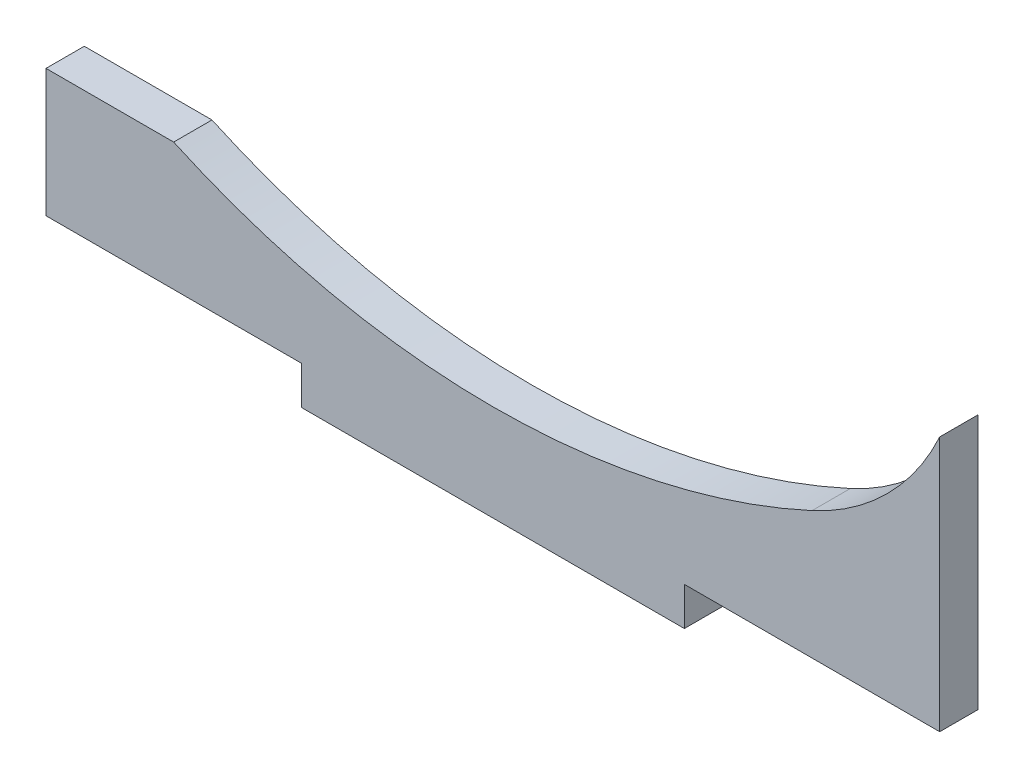
ISO-10303-21;
HEADER;
FILE_DESCRIPTION(('STEP AP214'),'2;1');
FILE_NAME('part.step','',(''),(''),'','','');
FILE_SCHEMA(('AUTOMOTIVE_DESIGN { 1 0 10303 214 1 1 1 1 }'));
ENDSEC;
DATA;
#1=APPLICATION_CONTEXT('core data for automotive mechanical design processes');
#2=APPLICATION_PROTOCOL_DEFINITION('international standard','automotive_design',2000,#1);
#3=PRODUCT_CONTEXT('',#1,'mechanical');
#4=PRODUCT('Part','Part','',(#3));
#5=PRODUCT_RELATED_PRODUCT_CATEGORY('part','',(#4));
#6=PRODUCT_DEFINITION_FORMATION('','',#4);
#7=PRODUCT_DEFINITION_CONTEXT('part definition',#1,'design');
#8=PRODUCT_DEFINITION('design','',#6,#7);
#9=PRODUCT_DEFINITION_SHAPE('','',#8);
#10=(LENGTH_UNIT() NAMED_UNIT(*) SI_UNIT(.MILLI.,.METRE.));
#11=(NAMED_UNIT(*) PLANE_ANGLE_UNIT() SI_UNIT($,.RADIAN.));
#12=(NAMED_UNIT(*) SI_UNIT($,.STERADIAN.) SOLID_ANGLE_UNIT());
#13=UNCERTAINTY_MEASURE_WITH_UNIT(LENGTH_MEASURE(1.E-05),#10,'distance_accuracy_value','');
#14=(GEOMETRIC_REPRESENTATION_CONTEXT(3) GLOBAL_UNCERTAINTY_ASSIGNED_CONTEXT((#13)) GLOBAL_UNIT_ASSIGNED_CONTEXT((#10,
#11,#12)) REPRESENTATION_CONTEXT('',''));
#15=CARTESIAN_POINT('',(0.,0.,0.));
#16=DIRECTION('',(0.,0.,1.));
#17=DIRECTION('',(1.,0.,0.));
#18=AXIS2_PLACEMENT_3D('',#15,#16,#17);
#19=CARTESIAN_POINT('',(0.,0.,3.));
#20=DIRECTION('',(-1.,0.,0.));
#21=DIRECTION('',(0.,-1.,0.));
#22=AXIS2_PLACEMENT_3D('',#19,#20,#21);
#23=PLANE('',#22);
#24=DIRECTION('',(0.,1.,0.));
#25=VECTOR('',#24,1.);
#26=CARTESIAN_POINT('',(0.,0.,0.));
#27=LINE('',#26,#25);
#28=CARTESIAN_POINT('',(0.,0.,0.));
#29=VERTEX_POINT('',#28);
#30=CARTESIAN_POINT('',(0.,20.,0.));
#31=VERTEX_POINT('',#30);
#32=EDGE_CURVE('E147',#29,#31,#27,.T.);
#33=ORIENTED_EDGE('',*,*,#32,.T.);
#34=DIRECTION('',(0.,0.,-1.));
#35=VECTOR('',#34,1.);
#36=CARTESIAN_POINT('',(0.,20.,3.));
#37=LINE('',#36,#35);
#38=CARTESIAN_POINT('',(0.,20.,3.));
#39=VERTEX_POINT('',#38);
#40=EDGE_CURVE('E11',#39,#31,#37,.T.);
#41=ORIENTED_EDGE('',*,*,#40,.F.);
#42=DIRECTION('',(0.,1.,0.));
#43=VECTOR('',#42,1.);
#44=CARTESIAN_POINT('',(0.,0.,3.));
#45=LINE('',#44,#43);
#46=CARTESIAN_POINT('',(0.,0.,3.));
#47=VERTEX_POINT('',#46);
#48=EDGE_CURVE('E165',#47,#39,#45,.T.);
#49=ORIENTED_EDGE('',*,*,#48,.F.);
#50=DIRECTION('',(0.,0.,-1.));
#51=VECTOR('',#50,1.);
#52=CARTESIAN_POINT('',(0.,0.,3.));
#53=LINE('',#52,#51);
#54=EDGE_CURVE('E143',#47,#29,#53,.T.);
#55=ORIENTED_EDGE('',*,*,#54,.T.);
#56=EDGE_LOOP('',(#33,#41,#49,#55));
#57=FACE_BOUND('',#56,.T.);
#58=ADVANCED_FACE('F39',(#57),#23,.F.);
#59=CARTESIAN_POINT('',(-18.4620809120403,28.4620809120403,3.));
#60=DIRECTION('',(0.,0.,-1.));
#61=DIRECTION('',(-1.,0.,0.));
#62=AXIS2_PLACEMENT_3D('',#59,#60,#61);
#63=CYLINDRICAL_SURFACE('',#62,20.3089941888967);
#64=CARTESIAN_POINT('',(-18.4620809120403,28.4620809120403,0.));
#65=DIRECTION('',(0.,0.,-1.));
#66=DIRECTION('',(1.,0.,0.));
#67=AXIS2_PLACEMENT_3D('',#64,#65,#66);
#68=CIRCLE('',#67,20.3089941888967);
#69=CARTESIAN_POINT('',(-10.,9.99999999999999,0.));
#70=VERTEX_POINT('',#69);
#71=EDGE_CURVE('E150',#31,#70,#68,.T.);
#72=ORIENTED_EDGE('',*,*,#71,.T.);
#73=DIRECTION('',(0.,0.,-1.));
#74=VECTOR('',#73,1.);
#75=CARTESIAN_POINT('',(-10.,9.99999999999999,3.));
#76=LINE('',#75,#74);
#77=CARTESIAN_POINT('',(-10.,9.99999999999999,3.));
#78=VERTEX_POINT('',#77);
#79=EDGE_CURVE('E47',#78,#70,#76,.T.);
#80=ORIENTED_EDGE('',*,*,#79,.F.);
#81=CARTESIAN_POINT('',(-18.4620809120403,28.4620809120403,3.));
#82=DIRECTION('',(0.,0.,-1.));
#83=DIRECTION('',(1.,0.,0.));
#84=AXIS2_PLACEMENT_3D('',#81,#82,#83);
#85=CIRCLE('',#84,20.3089941888967);
#86=EDGE_CURVE('E104',#39,#78,#85,.T.);
#87=ORIENTED_EDGE('',*,*,#86,.F.);
#88=ORIENTED_EDGE('',*,*,#40,.T.);
#89=EDGE_LOOP('',(#72,#80,#87,#88));
#90=FACE_BOUND('',#89,.T.);
#91=ADVANCED_FACE('F214',(#90),#63,.F.);
#92=CARTESIAN_POINT('',(-35.,64.5435605731786,3.));
#93=DIRECTION('',(0.,0.,-1.));
#94=DIRECTION('',(-1.,0.,0.));
#95=AXIS2_PLACEMENT_3D('',#92,#93,#94);
#96=CYLINDRICAL_SURFACE('',#95,60.);
#97=CARTESIAN_POINT('',(-35.,64.5435605731786,0.));
#98=DIRECTION('',(0.,0.,-1.));
#99=DIRECTION('',(-1.,0.,0.));
#100=AXIS2_PLACEMENT_3D('',#97,#98,#99);
#101=CIRCLE('',#100,60.);
#102=CARTESIAN_POINT('',(-60.,10.,0.));
#103=VERTEX_POINT('',#102);
#104=EDGE_CURVE('E152',#70,#103,#101,.T.);
#105=ORIENTED_EDGE('',*,*,#104,.T.);
#106=DIRECTION('',(0.,0.,-1.));
#107=VECTOR('',#106,1.);
#108=CARTESIAN_POINT('',(-60.,10.,3.));
#109=LINE('',#108,#107);
#110=CARTESIAN_POINT('',(-60.,10.,3.));
#111=VERTEX_POINT('',#110);
#112=EDGE_CURVE('E178',#111,#103,#109,.T.);
#113=ORIENTED_EDGE('',*,*,#112,.F.);
#114=CARTESIAN_POINT('',(-35.,64.5435605731786,3.));
#115=DIRECTION('',(0.,0.,-1.));
#116=DIRECTION('',(-1.,0.,0.));
#117=AXIS2_PLACEMENT_3D('',#114,#115,#116);
#118=CIRCLE('',#117,60.);
#119=EDGE_CURVE('E186',#78,#111,#118,.T.);
#120=ORIENTED_EDGE('',*,*,#119,.F.);
#121=ORIENTED_EDGE('',*,*,#79,.T.);
#122=EDGE_LOOP('',(#105,#113,#120,#121));
#123=FACE_BOUND('',#122,.T.);
#124=ADVANCED_FACE('F184',(#123),#96,.F.);
#125=CARTESIAN_POINT('',(-70.,10.,3.));
#126=DIRECTION('',(0.,-1.,0.));
#127=DIRECTION('',(0.,0.,-1.));
#128=AXIS2_PLACEMENT_3D('',#125,#126,#127);
#129=PLANE('',#128);
#130=DIRECTION('',(-1.,0.,0.));
#131=VECTOR('',#130,1.);
#132=CARTESIAN_POINT('',(-70.,10.,0.));
#133=LINE('',#132,#131);
#134=CARTESIAN_POINT('',(-70.,10.,0.));
#135=VERTEX_POINT('',#134);
#136=EDGE_CURVE('E154',#103,#135,#133,.T.);
#137=ORIENTED_EDGE('',*,*,#136,.T.);
#138=DIRECTION('',(0.,0.,-1.));
#139=VECTOR('',#138,1.);
#140=CARTESIAN_POINT('',(-70.,10.,3.));
#141=LINE('',#140,#139);
#142=CARTESIAN_POINT('',(-70.,10.,3.));
#143=VERTEX_POINT('',#142);
#144=EDGE_CURVE('E175',#143,#135,#141,.T.);
#145=ORIENTED_EDGE('',*,*,#144,.F.);
#146=DIRECTION('',(-1.,0.,0.));
#147=VECTOR('',#146,1.);
#148=CARTESIAN_POINT('',(-70.,10.,3.));
#149=LINE('',#148,#147);
#150=EDGE_CURVE('E204',#111,#143,#149,.T.);
#151=ORIENTED_EDGE('',*,*,#150,.F.);
#152=ORIENTED_EDGE('',*,*,#112,.T.);
#153=EDGE_LOOP('',(#137,#145,#151,#152));
#154=FACE_BOUND('',#153,.T.);
#155=ADVANCED_FACE('F195',(#154),#129,.F.);
#156=CARTESIAN_POINT('',(-70.,0.,3.));
#157=DIRECTION('',(1.,0.,0.));
#158=DIRECTION('',(0.,0.,-1.));
#159=AXIS2_PLACEMENT_3D('',#156,#157,#158);
#160=PLANE('',#159);
#161=DIRECTION('',(0.,-1.,0.));
#162=VECTOR('',#161,1.);
#163=CARTESIAN_POINT('',(-70.,0.,0.));
#164=LINE('',#163,#162);
#165=CARTESIAN_POINT('',(-70.,0.,0.));
#166=VERTEX_POINT('',#165);
#167=EDGE_CURVE('E156',#135,#166,#164,.T.);
#168=ORIENTED_EDGE('',*,*,#167,.T.);
#169=DIRECTION('',(0.,0.,-1.));
#170=VECTOR('',#169,1.);
#171=CARTESIAN_POINT('',(-70.,0.,3.));
#172=LINE('',#171,#170);
#173=CARTESIAN_POINT('',(-70.,0.,3.));
#174=VERTEX_POINT('',#173);
#175=EDGE_CURVE('E172',#174,#166,#172,.T.);
#176=ORIENTED_EDGE('',*,*,#175,.F.);
#177=DIRECTION('',(0.,-1.,0.));
#178=VECTOR('',#177,1.);
#179=CARTESIAN_POINT('',(-70.,0.,3.));
#180=LINE('',#179,#178);
#181=EDGE_CURVE('E201',#143,#174,#180,.T.);
#182=ORIENTED_EDGE('',*,*,#181,.F.);
#183=ORIENTED_EDGE('',*,*,#144,.T.);
#184=EDGE_LOOP('',(#168,#176,#182,#183));
#185=FACE_BOUND('',#184,.T.);
#186=ADVANCED_FACE('F199',(#185),#160,.F.);
#187=CARTESIAN_POINT('',(-50.,0.,3.));
#188=DIRECTION('',(0.,1.,0.));
#189=DIRECTION('',(-1.,0.,0.));
#190=AXIS2_PLACEMENT_3D('',#187,#188,#189);
#191=PLANE('',#190);
#192=DIRECTION('',(1.,0.,0.));
#193=VECTOR('',#192,1.);
#194=CARTESIAN_POINT('',(-50.,0.,0.));
#195=LINE('',#194,#193);
#196=CARTESIAN_POINT('',(-50.,0.,0.));
#197=VERTEX_POINT('',#196);
#198=EDGE_CURVE('E158',#166,#197,#195,.T.);
#199=ORIENTED_EDGE('',*,*,#198,.T.);
#200=DIRECTION('',(0.,0.,-1.));
#201=VECTOR('',#200,1.);
#202=CARTESIAN_POINT('',(-50.,0.,3.));
#203=LINE('',#202,#201);
#204=CARTESIAN_POINT('',(-50.,0.,3.));
#205=VERTEX_POINT('',#204);
#206=EDGE_CURVE('E169',#205,#197,#203,.T.);
#207=ORIENTED_EDGE('',*,*,#206,.F.);
#208=DIRECTION('',(1.,0.,0.));
#209=VECTOR('',#208,1.);
#210=CARTESIAN_POINT('',(-50.,0.,3.));
#211=LINE('',#210,#209);
#212=EDGE_CURVE('E203',#174,#205,#211,.T.);
#213=ORIENTED_EDGE('',*,*,#212,.F.);
#214=ORIENTED_EDGE('',*,*,#175,.T.);
#215=EDGE_LOOP('',(#199,#207,#213,#214));
#216=FACE_BOUND('',#215,.T.);
#217=ADVANCED_FACE('F226',(#216),#191,.F.);
#218=CARTESIAN_POINT('',(-50.,-3.,3.));
#219=DIRECTION('',(1.,0.,0.));
#220=DIRECTION('',(0.,0.,-1.));
#221=AXIS2_PLACEMENT_3D('',#218,#219,#220);
#222=PLANE('',#221);
#223=DIRECTION('',(0.,-1.,0.));
#224=VECTOR('',#223,1.);
#225=CARTESIAN_POINT('',(-50.,-3.,0.));
#226=LINE('',#225,#224);
#227=CARTESIAN_POINT('',(-50.,-3.,0.));
#228=VERTEX_POINT('',#227);
#229=EDGE_CURVE('E160',#197,#228,#226,.T.);
#230=ORIENTED_EDGE('',*,*,#229,.T.);
#231=DIRECTION('',(0.,0.,-1.));
#232=VECTOR('',#231,1.);
#233=CARTESIAN_POINT('',(-50.,-3.,3.));
#234=LINE('',#233,#232);
#235=CARTESIAN_POINT('',(-50.,-3.,3.));
#236=VERTEX_POINT('',#235);
#237=EDGE_CURVE('E138',#236,#228,#234,.T.);
#238=ORIENTED_EDGE('',*,*,#237,.F.);
#239=DIRECTION('',(0.,-1.,0.));
#240=VECTOR('',#239,1.);
#241=CARTESIAN_POINT('',(-50.,-3.,3.));
#242=LINE('',#241,#240);
#243=EDGE_CURVE('E129',#205,#236,#242,.T.);
#244=ORIENTED_EDGE('',*,*,#243,.F.);
#245=ORIENTED_EDGE('',*,*,#206,.T.);
#246=EDGE_LOOP('',(#230,#238,#244,#245));
#247=FACE_BOUND('',#246,.T.);
#248=ADVANCED_FACE('F229',(#247),#222,.F.);
#249=CARTESIAN_POINT('',(-20.,-3.,3.));
#250=DIRECTION('',(0.,1.,0.));
#251=DIRECTION('',(-1.,0.,0.));
#252=AXIS2_PLACEMENT_3D('',#249,#250,#251);
#253=PLANE('',#252);
#254=DIRECTION('',(1.,0.,0.));
#255=VECTOR('',#254,1.);
#256=CARTESIAN_POINT('',(-20.,-3.,0.));
#257=LINE('',#256,#255);
#258=CARTESIAN_POINT('',(-20.,-3.,0.));
#259=VERTEX_POINT('',#258);
#260=EDGE_CURVE('E137',#228,#259,#257,.T.);
#261=ORIENTED_EDGE('',*,*,#260,.T.);
#262=DIRECTION('',(0.,0.,-1.));
#263=VECTOR('',#262,1.);
#264=CARTESIAN_POINT('',(-20.,-3.,3.));
#265=LINE('',#264,#263);
#266=CARTESIAN_POINT('',(-20.,-3.,3.));
#267=VERTEX_POINT('',#266);
#268=EDGE_CURVE('E134',#267,#259,#265,.T.);
#269=ORIENTED_EDGE('',*,*,#268,.F.);
#270=DIRECTION('',(1.,0.,0.));
#271=VECTOR('',#270,1.);
#272=CARTESIAN_POINT('',(-20.,-3.,3.));
#273=LINE('',#272,#271);
#274=EDGE_CURVE('E123',#236,#267,#273,.T.);
#275=ORIENTED_EDGE('',*,*,#274,.F.);
#276=ORIENTED_EDGE('',*,*,#237,.T.);
#277=EDGE_LOOP('',(#261,#269,#275,#276));
#278=FACE_BOUND('',#277,.T.);
#279=ADVANCED_FACE('F135',(#278),#253,.F.);
#280=CARTESIAN_POINT('',(-20.,0.,3.));
#281=DIRECTION('',(-1.,0.,0.));
#282=DIRECTION('',(0.,0.,1.));
#283=AXIS2_PLACEMENT_3D('',#280,#281,#282);
#284=PLANE('',#283);
#285=DIRECTION('',(0.,1.,0.));
#286=VECTOR('',#285,1.);
#287=CARTESIAN_POINT('',(-20.,0.,0.));
#288=LINE('',#287,#286);
#289=CARTESIAN_POINT('',(-20.,0.,0.));
#290=VERTEX_POINT('',#289);
#291=EDGE_CURVE('E90',#259,#290,#288,.T.);
#292=ORIENTED_EDGE('',*,*,#291,.T.);
#293=DIRECTION('',(0.,0.,-1.));
#294=VECTOR('',#293,1.);
#295=CARTESIAN_POINT('',(-20.,0.,3.));
#296=LINE('',#295,#294);
#297=CARTESIAN_POINT('',(-20.,0.,3.));
#298=VERTEX_POINT('',#297);
#299=EDGE_CURVE('E139',#298,#290,#296,.T.);
#300=ORIENTED_EDGE('',*,*,#299,.F.);
#301=DIRECTION('',(0.,1.,0.));
#302=VECTOR('',#301,1.);
#303=CARTESIAN_POINT('',(-20.,0.,3.));
#304=LINE('',#303,#302);
#305=EDGE_CURVE('E127',#267,#298,#304,.T.);
#306=ORIENTED_EDGE('',*,*,#305,.F.);
#307=ORIENTED_EDGE('',*,*,#268,.T.);
#308=EDGE_LOOP('',(#292,#300,#306,#307));
#309=FACE_BOUND('',#308,.T.);
#310=ADVANCED_FACE('F141',(#309),#284,.F.);
#311=CARTESIAN_POINT('',(0.,0.,3.));
#312=DIRECTION('',(0.,1.,0.));
#313=DIRECTION('',(-1.,0.,0.));
#314=AXIS2_PLACEMENT_3D('',#311,#312,#313);
#315=PLANE('',#314);
#316=DIRECTION('',(1.,0.,0.));
#317=VECTOR('',#316,1.);
#318=CARTESIAN_POINT('',(0.,0.,0.));
#319=LINE('',#318,#317);
#320=EDGE_CURVE('E96',#290,#29,#319,.T.);
#321=ORIENTED_EDGE('',*,*,#320,.T.);
#322=ORIENTED_EDGE('',*,*,#54,.F.);
#323=DIRECTION('',(1.,0.,0.));
#324=VECTOR('',#323,1.);
#325=CARTESIAN_POINT('',(0.,0.,3.));
#326=LINE('',#325,#324);
#327=EDGE_CURVE('E55',#298,#47,#326,.T.);
#328=ORIENTED_EDGE('',*,*,#327,.F.);
#329=ORIENTED_EDGE('',*,*,#299,.T.);
#330=EDGE_LOOP('',(#321,#322,#328,#329));
#331=FACE_BOUND('',#330,.T.);
#332=ADVANCED_FACE('F238',(#331),#315,.F.);
#333=CARTESIAN_POINT('',(-18.4620809120403,28.4620809120403,3.));
#334=DIRECTION('',(0.,0.,1.));
#335=DIRECTION('',(1.,0.,0.));
#336=AXIS2_PLACEMENT_3D('',#333,#334,#335);
#337=PLANE('',#336);
#338=ORIENTED_EDGE('',*,*,#48,.T.);
#339=ORIENTED_EDGE('',*,*,#86,.T.);
#340=ORIENTED_EDGE('',*,*,#119,.T.);
#341=ORIENTED_EDGE('',*,*,#150,.T.);
#342=ORIENTED_EDGE('',*,*,#181,.T.);
#343=ORIENTED_EDGE('',*,*,#212,.T.);
#344=ORIENTED_EDGE('',*,*,#243,.T.);
#345=ORIENTED_EDGE('',*,*,#274,.T.);
#346=ORIENTED_EDGE('',*,*,#305,.T.);
#347=ORIENTED_EDGE('',*,*,#327,.T.);
#348=EDGE_LOOP('',(#338,#339,#340,#341,#342,#343,#344,#345,#346,#347));
#349=FACE_BOUND('',#348,.T.);
#350=ADVANCED_FACE('F125',(#349),#337,.T.);
#351=CARTESIAN_POINT('',(-18.4620809120403,28.4620809120403,0.));
#352=DIRECTION('',(0.,0.,1.));
#353=DIRECTION('',(1.,0.,0.));
#354=AXIS2_PLACEMENT_3D('',#351,#352,#353);
#355=PLANE('',#354);
#356=ORIENTED_EDGE('',*,*,#32,.F.);
#357=ORIENTED_EDGE('',*,*,#320,.F.);
#358=ORIENTED_EDGE('',*,*,#291,.F.);
#359=ORIENTED_EDGE('',*,*,#260,.F.);
#360=ORIENTED_EDGE('',*,*,#229,.F.);
#361=ORIENTED_EDGE('',*,*,#198,.F.);
#362=ORIENTED_EDGE('',*,*,#167,.F.);
#363=ORIENTED_EDGE('',*,*,#136,.F.);
#364=ORIENTED_EDGE('',*,*,#104,.F.);
#365=ORIENTED_EDGE('',*,*,#71,.F.);
#366=EDGE_LOOP('',(#356,#357,#358,#359,#360,#361,#362,#363,#364,#365));
#367=FACE_BOUND('',#366,.T.);
#368=ADVANCED_FACE('F190',(#367),#355,.F.);
#369=CLOSED_SHELL('',(#58,#91,#124,#155,#186,#217,#248,#279,#310,#332,#350,#368));
#370=MANIFOLD_SOLID_BREP('B2',#369);
#371=ADVANCED_BREP_SHAPE_REPRESENTATION('',(#18,#370),#14);
#372=SHAPE_DEFINITION_REPRESENTATION(#9,#371);
ENDSEC;
END-ISO-10303-21;
